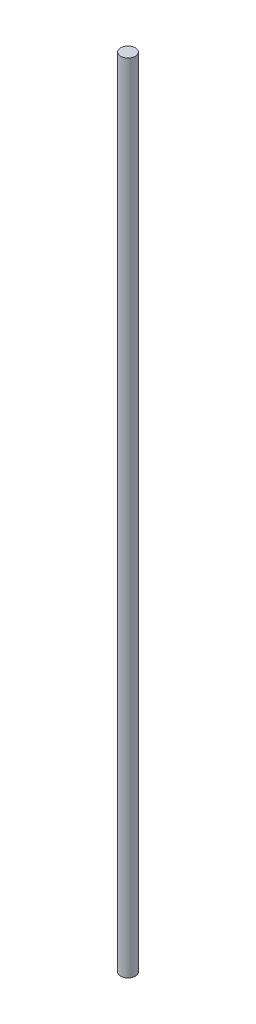
ISO-10303-21;
HEADER;
FILE_DESCRIPTION(('STEP AP214'),'2;1');
FILE_NAME('part.step','',(''),(''),'','','');
FILE_SCHEMA(('AUTOMOTIVE_DESIGN { 1 0 10303 214 1 1 1 1 }'));
ENDSEC;
DATA;
#1=APPLICATION_CONTEXT('core data for automotive mechanical design processes');
#2=APPLICATION_PROTOCOL_DEFINITION('international standard','automotive_design',2000,#1);
#3=PRODUCT_CONTEXT('',#1,'mechanical');
#4=PRODUCT('Part','Part','',(#3));
#5=PRODUCT_RELATED_PRODUCT_CATEGORY('part','',(#4));
#6=PRODUCT_DEFINITION_FORMATION('','',#4);
#7=PRODUCT_DEFINITION_CONTEXT('part definition',#1,'design');
#8=PRODUCT_DEFINITION('design','',#6,#7);
#9=PRODUCT_DEFINITION_SHAPE('','',#8);
#10=(LENGTH_UNIT() NAMED_UNIT(*) SI_UNIT(.MILLI.,.METRE.));
#11=(NAMED_UNIT(*) PLANE_ANGLE_UNIT() SI_UNIT($,.RADIAN.));
#12=(NAMED_UNIT(*) SI_UNIT($,.STERADIAN.) SOLID_ANGLE_UNIT());
#13=UNCERTAINTY_MEASURE_WITH_UNIT(LENGTH_MEASURE(1.E-05),#10,'distance_accuracy_value','');
#14=(GEOMETRIC_REPRESENTATION_CONTEXT(3) GLOBAL_UNCERTAINTY_ASSIGNED_CONTEXT((#13)) GLOBAL_UNIT_ASSIGNED_CONTEXT((#10,
#11,#12)) REPRESENTATION_CONTEXT('',''));
#15=CARTESIAN_POINT('',(0.,0.,0.));
#16=DIRECTION('',(0.,0.,1.));
#17=DIRECTION('',(1.,0.,0.));
#18=AXIS2_PLACEMENT_3D('',#15,#16,#17);
#19=CARTESIAN_POINT('',(6.00000000000138,-5810.63539052503,0.));
#20=DIRECTION('',(0.,-1.,0.));
#21=DIRECTION('',(0.,0.,-1.));
#22=AXIS2_PLACEMENT_3D('',#19,#20,#21);
#23=PLANE('',#22);
#24=CARTESIAN_POINT('',(0.,-5810.63539052503,0.));
#25=DIRECTION('',(0.,1.,0.));
#26=DIRECTION('',(0.,0.,1.));
#27=AXIS2_PLACEMENT_3D('',#24,#25,#26);
#28=CIRCLE('',#27,6.00000000000138);
#29=CARTESIAN_POINT('',(0.,-5810.63539052503,6.00000000000138));
#30=VERTEX_POINT('',#29);
#31=EDGE_CURVE('E10',#30,#30,#28,.T.);
#32=ORIENTED_EDGE('',*,*,#31,.F.);
#33=EDGE_LOOP('',(#32));
#34=FACE_BOUND('',#33,.T.);
#35=ADVANCED_FACE('F38',(#34),#23,.T.);
#36=CARTESIAN_POINT('',(0.,5487.18053777214,0.));
#37=DIRECTION('',(0.,1.,0.));
#38=DIRECTION('',(0.,0.,1.));
#39=AXIS2_PLACEMENT_3D('',#36,#37,#38);
#40=CYLINDRICAL_SURFACE('',#39,6.00000000000134);
#41=ORIENTED_EDGE('',*,*,#31,.T.);
#42=EDGE_LOOP('',(#41));
#43=FACE_BOUND('',#42,.T.);
#44=CARTESIAN_POINT('',(0.,-5160.63539052503,0.));
#45=DIRECTION('',(0.,1.,0.));
#46=DIRECTION('',(0.,0.,1.));
#47=AXIS2_PLACEMENT_3D('',#44,#45,#46);
#48=CIRCLE('',#47,6.0000000000013);
#49=CARTESIAN_POINT('',(0.,-5160.63539052503,6.0000000000013));
#50=VERTEX_POINT('',#49);
#51=EDGE_CURVE('E47',#50,#50,#48,.T.);
#52=ORIENTED_EDGE('',*,*,#51,.F.);
#53=EDGE_LOOP('',(#52));
#54=FACE_BOUND('',#53,.T.);
#55=ADVANCED_FACE('F82',(#43,#54),#40,.T.);
#56=CARTESIAN_POINT('',(6.0000000000013,-5160.63539052503,0.));
#57=DIRECTION('',(0.,1.,0.));
#58=DIRECTION('',(0.,0.,1.));
#59=AXIS2_PLACEMENT_3D('',#56,#57,#58);
#60=PLANE('',#59);
#61=ORIENTED_EDGE('',*,*,#51,.T.);
#62=EDGE_LOOP('',(#61));
#63=FACE_BOUND('',#62,.T.);
#64=ADVANCED_FACE('F79',(#63),#60,.T.);
#65=CLOSED_SHELL('',(#35,#55,#64));
#66=CARTESIAN_POINT('',(6.00000000000138,-5808.09539052503,0.));
#67=DIRECTION('',(0.,-1.,0.));
#68=DIRECTION('',(0.,0.,-1.));
#69=AXIS2_PLACEMENT_3D('',#66,#67,#68);
#70=PLANE('',#69);
#71=CARTESIAN_POINT('',(0.,-5808.09539052503,0.));
#72=DIRECTION('',(0.,1.,0.));
#73=DIRECTION('',(0.,0.,1.));
#74=AXIS2_PLACEMENT_3D('',#71,#72,#73);
#75=CIRCLE('',#74,3.46000000000138);
#76=CARTESIAN_POINT('',(0.,-5808.09539052503,3.46000000000138));
#77=VERTEX_POINT('',#76);
#78=EDGE_CURVE('E57',#77,#77,#75,.T.);
#79=ORIENTED_EDGE('',*,*,#78,.T.);
#80=EDGE_LOOP('',(#79));
#81=FACE_BOUND('',#80,.T.);
#82=ADVANCED_FACE('F40',(#81),#70,.F.);
#83=CARTESIAN_POINT('',(6.0000000000013,-5163.17539052503,0.));
#84=DIRECTION('',(0.,1.,0.));
#85=DIRECTION('',(0.,0.,1.));
#86=AXIS2_PLACEMENT_3D('',#83,#84,#85);
#87=PLANE('',#86);
#88=CARTESIAN_POINT('',(0.,-5163.17539052503,0.));
#89=DIRECTION('',(0.,1.,0.));
#90=DIRECTION('',(0.,0.,1.));
#91=AXIS2_PLACEMENT_3D('',#88,#89,#90);
#92=CIRCLE('',#91,3.4600000000013);
#93=CARTESIAN_POINT('',(0.,-5163.17539052503,3.4600000000013));
#94=VERTEX_POINT('',#93);
#95=EDGE_CURVE('E52',#94,#94,#92,.T.);
#96=ORIENTED_EDGE('',*,*,#95,.F.);
#97=EDGE_LOOP('',(#96));
#98=FACE_BOUND('',#97,.T.);
#99=ADVANCED_FACE('F68',(#98),#87,.F.);
#100=CARTESIAN_POINT('',(0.,5487.18053777214,0.));
#101=DIRECTION('',(0.,1.,0.));
#102=DIRECTION('',(0.,0.,1.));
#103=AXIS2_PLACEMENT_3D('',#100,#101,#102);
#104=CYLINDRICAL_SURFACE('',#103,3.46000000000134);
#105=ORIENTED_EDGE('',*,*,#78,.F.);
#106=EDGE_LOOP('',(#105));
#107=FACE_BOUND('',#106,.T.);
#108=ORIENTED_EDGE('',*,*,#95,.T.);
#109=EDGE_LOOP('',(#108));
#110=FACE_BOUND('',#109,.T.);
#111=ADVANCED_FACE('F65',(#107,#110),#104,.F.);
#112=CLOSED_SHELL('',(#82,#99,#111));
#113=ORIENTED_CLOSED_SHELL('',*,#112,.T.);
#114=BREP_WITH_VOIDS('B2',#65,(#113));
#115=ADVANCED_BREP_SHAPE_REPRESENTATION('',(#18,#114),#14);
#116=SHAPE_DEFINITION_REPRESENTATION(#9,#115);
ENDSEC;
END-ISO-10303-21;
